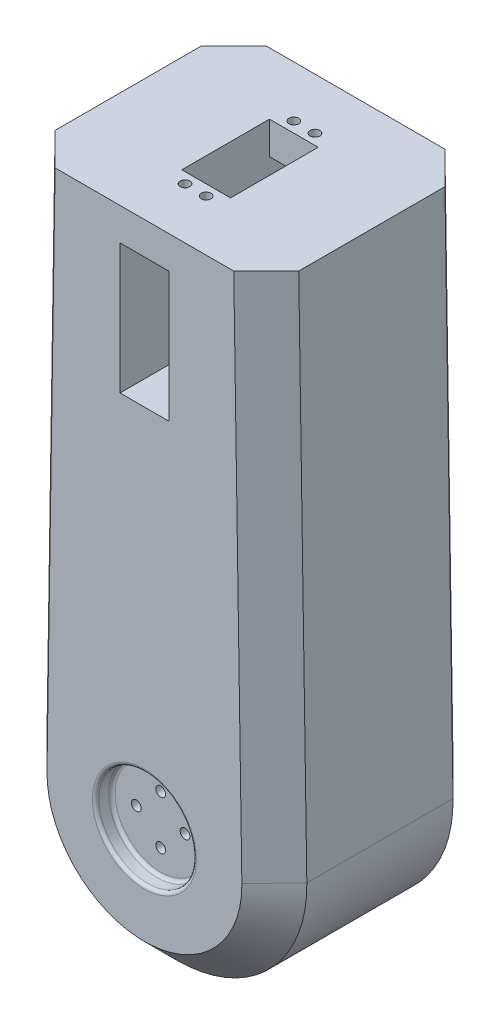
ISO-10303-21;
HEADER;
FILE_DESCRIPTION(('STEP AP214'),'2;1');
FILE_NAME('part.step','',(''),(''),'','','');
FILE_SCHEMA(('AUTOMOTIVE_DESIGN { 1 0 10303 214 1 1 1 1 }'));
ENDSEC;
DATA;
#1=APPLICATION_CONTEXT('core data for automotive mechanical design processes');
#2=APPLICATION_PROTOCOL_DEFINITION('international standard','automotive_design',2000,#1);
#3=PRODUCT_CONTEXT('',#1,'mechanical');
#4=PRODUCT('Part','Part','',(#3));
#5=PRODUCT_RELATED_PRODUCT_CATEGORY('part','',(#4));
#6=PRODUCT_DEFINITION_FORMATION('','',#4);
#7=PRODUCT_DEFINITION_CONTEXT('part definition',#1,'design');
#8=PRODUCT_DEFINITION('design','',#6,#7);
#9=PRODUCT_DEFINITION_SHAPE('','',#8);
#10=(LENGTH_UNIT() NAMED_UNIT(*) SI_UNIT(.MILLI.,.METRE.));
#11=(NAMED_UNIT(*) PLANE_ANGLE_UNIT() SI_UNIT($,.RADIAN.));
#12=(NAMED_UNIT(*) SI_UNIT($,.STERADIAN.) SOLID_ANGLE_UNIT());
#13=UNCERTAINTY_MEASURE_WITH_UNIT(LENGTH_MEASURE(1.E-05),#10,'distance_accuracy_value','');
#14=(GEOMETRIC_REPRESENTATION_CONTEXT(3) GLOBAL_UNCERTAINTY_ASSIGNED_CONTEXT((#13)) GLOBAL_UNIT_ASSIGNED_CONTEXT((#10,
#11,#12)) REPRESENTATION_CONTEXT('',''));
#15=CARTESIAN_POINT('',(0.,0.,0.));
#16=DIRECTION('',(0.,0.,1.));
#17=DIRECTION('',(1.,0.,0.));
#18=AXIS2_PLACEMENT_3D('',#15,#16,#17);
#19=CARTESIAN_POINT('',(-7.49999999999999,152.5,0.));
#20=DIRECTION('',(0.,1.,0.));
#21=DIRECTION('',(0.,0.,1.));
#22=AXIS2_PLACEMENT_3D('',#19,#20,#21);
#23=PLANE('',#22);
#24=CARTESIAN_POINT('',(-3.25,152.5,49.25));
#25=DIRECTION('',(0.,1.,0.));
#26=DIRECTION('',(0.,0.,1.));
#27=AXIS2_PLACEMENT_3D('',#24,#25,#26);
#28=CIRCLE('',#27,1.5);
#29=CARTESIAN_POINT('',(-3.25,152.5,50.75));
#30=VERTEX_POINT('',#29);
#31=EDGE_CURVE('E497',#30,#30,#28,.F.);
#32=ORIENTED_EDGE('',*,*,#31,.F.);
#33=EDGE_LOOP('',(#32));
#34=FACE_BOUND('',#33,.T.);
#35=CARTESIAN_POINT('',(3.25,152.5,49.25));
#36=DIRECTION('',(0.,1.,0.));
#37=DIRECTION('',(0.,0.,1.));
#38=AXIS2_PLACEMENT_3D('',#35,#36,#37);
#39=CIRCLE('',#38,1.5);
#40=CARTESIAN_POINT('',(3.25,152.5,50.75));
#41=VERTEX_POINT('',#40);
#42=EDGE_CURVE('E491',#41,#41,#39,.F.);
#43=ORIENTED_EDGE('',*,*,#42,.F.);
#44=EDGE_LOOP('',(#43));
#45=FACE_BOUND('',#44,.T.);
#46=DIRECTION('',(0.,0.,1.));
#47=VECTOR('',#46,1.);
#48=CARTESIAN_POINT('',(-7.49999999999999,152.5,0.));
#49=LINE('',#48,#47);
#50=CARTESIAN_POINT('',(-7.49999999999999,152.5,46.));
#51=VERTEX_POINT('',#50);
#52=CARTESIAN_POINT('',(-7.49999999999999,152.5,65.));
#53=VERTEX_POINT('',#52);
#54=EDGE_CURVE('E239',#51,#53,#49,.T.);
#55=ORIENTED_EDGE('',*,*,#54,.F.);
#56=DIRECTION('',(-1.,0.,0.));
#57=VECTOR('',#56,1.);
#58=CARTESIAN_POINT('',(-7.49999999999999,152.5,46.));
#59=LINE('',#58,#57);
#60=CARTESIAN_POINT('',(7.50000000000001,152.5,46.));
#61=VERTEX_POINT('',#60);
#62=EDGE_CURVE('E190',#61,#51,#59,.T.);
#63=ORIENTED_EDGE('',*,*,#62,.F.);
#64=DIRECTION('',(0.,0.,1.));
#65=VECTOR('',#64,1.);
#66=CARTESIAN_POINT('',(7.50000000000001,152.5,0.));
#67=LINE('',#66,#65);
#68=CARTESIAN_POINT('',(7.50000000000001,152.5,65.));
#69=VERTEX_POINT('',#68);
#70=EDGE_CURVE('E216',#61,#69,#67,.T.);
#71=ORIENTED_EDGE('',*,*,#70,.T.);
#72=DIRECTION('',(-1.,0.,0.));
#73=VECTOR('',#72,1.);
#74=CARTESIAN_POINT('',(-7.49999999999999,152.5,65.));
#75=LINE('',#74,#73);
#76=EDGE_CURVE('E220',#69,#53,#75,.T.);
#77=ORIENTED_EDGE('',*,*,#76,.T.);
#78=EDGE_LOOP('',(#55,#63,#71,#77));
#79=FACE_BOUND('',#78,.T.);
#80=ADVANCED_FACE('F44',(#34,#45,#79),#23,.F.);
#81=CARTESIAN_POINT('',(37.5,162.5,65.));
#82=DIRECTION('',(-0.999881227698869,-0.0154120243771841,0.));
#83=DIRECTION('',(0.0154120243771841,-0.999881227698869,0.));
#84=AXIS2_PLACEMENT_3D('',#81,#82,#83);
#85=PLANE('',#84);
#86=DIRECTION('',(0.,0.,-1.));
#87=VECTOR('',#86,1.);
#88=CARTESIAN_POINT('',(39.9952491079548,0.616480975087377,65.));
#89=LINE('',#88,#87);
#90=CARTESIAN_POINT('',(39.9952491079548,0.616480975087377,54.9999999999999));
#91=VERTEX_POINT('',#90);
#92=CARTESIAN_POINT('',(39.9952491079548,0.616480975087377,10.));
#93=VERTEX_POINT('',#92);
#94=EDGE_CURVE('E280',#91,#93,#89,.T.);
#95=ORIENTED_EDGE('',*,*,#94,.T.);
#96=DIRECTION('',(-0.0154120243771841,0.999881227698869,0.));
#97=VECTOR('',#96,1.);
#98=CARTESIAN_POINT('',(37.5,162.5,10.));
#99=LINE('',#98,#97);
#100=CARTESIAN_POINT('',(37.5,162.5,10.));
#101=VERTEX_POINT('',#100);
#102=EDGE_CURVE('E338',#93,#101,#99,.T.);
#103=ORIENTED_EDGE('',*,*,#102,.T.);
#104=DIRECTION('',(0.,0.,-1.));
#105=VECTOR('',#104,1.);
#106=CARTESIAN_POINT('',(37.5,162.5,65.));
#107=LINE('',#106,#105);
#108=CARTESIAN_POINT('',(37.5,162.5,54.9999999999999));
#109=VERTEX_POINT('',#108);
#110=EDGE_CURVE('E297',#109,#101,#107,.T.);
#111=ORIENTED_EDGE('',*,*,#110,.F.);
#112=DIRECTION('',(0.0154120243771841,-0.999881227698869,0.));
#113=VECTOR('',#112,1.);
#114=CARTESIAN_POINT('',(39.9952491079547,0.616480975087377,54.9999999999999));
#115=LINE('',#114,#113);
#116=EDGE_CURVE('E335',#109,#91,#115,.T.);
#117=ORIENTED_EDGE('',*,*,#116,.T.);
#118=EDGE_LOOP('',(#95,#103,#111,#117));
#119=FACE_BOUND('',#118,.T.);
#120=ADVANCED_FACE('F421',(#119),#85,.F.);
#121=CARTESIAN_POINT('',(-37.5,162.5,65.));
#122=DIRECTION('',(0.,-1.,0.));
#123=DIRECTION('',(0.,0.,-1.));
#124=AXIS2_PLACEMENT_3D('',#121,#122,#123);
#125=PLANE('',#124);
#126=CARTESIAN_POINT('',(-3.25,162.5,49.25));
#127=DIRECTION('',(0.,1.,0.));
#128=DIRECTION('',(0.,0.,-1.));
#129=AXIS2_PLACEMENT_3D('',#126,#127,#128);
#130=CIRCLE('',#129,1.5);
#131=CARTESIAN_POINT('',(-3.25,162.5,47.75));
#132=VERTEX_POINT('',#131);
#133=EDGE_CURVE('E472',#132,#132,#130,.T.);
#134=ORIENTED_EDGE('',*,*,#133,.F.);
#135=EDGE_LOOP('',(#134));
#136=FACE_BOUND('',#135,.T.);
#137=CARTESIAN_POINT('',(3.25,162.5,49.25));
#138=DIRECTION('',(0.,1.,0.));
#139=DIRECTION('',(0.,0.,1.));
#140=AXIS2_PLACEMENT_3D('',#137,#138,#139);
#141=CIRCLE('',#140,1.5);
#142=CARTESIAN_POINT('',(3.25,162.5,50.75));
#143=VERTEX_POINT('',#142);
#144=EDGE_CURVE('E487',#143,#143,#141,.T.);
#145=ORIENTED_EDGE('',*,*,#144,.F.);
#146=EDGE_LOOP('',(#145));
#147=FACE_BOUND('',#146,.T.);
#148=CARTESIAN_POINT('',(3.25,162.5,15.75));
#149=DIRECTION('',(0.,1.,0.));
#150=DIRECTION('',(0.,0.,-1.));
#151=AXIS2_PLACEMENT_3D('',#148,#149,#150);
#152=CIRCLE('',#151,1.5);
#153=CARTESIAN_POINT('',(3.25,162.5,14.25));
#154=VERTEX_POINT('',#153);
#155=EDGE_CURVE('E482',#154,#154,#152,.T.);
#156=ORIENTED_EDGE('',*,*,#155,.F.);
#157=EDGE_LOOP('',(#156));
#158=FACE_BOUND('',#157,.T.);
#159=CARTESIAN_POINT('',(-3.25,162.5,15.75));
#160=DIRECTION('',(0.,1.,0.));
#161=DIRECTION('',(0.,0.,1.));
#162=AXIS2_PLACEMENT_3D('',#159,#160,#161);
#163=CIRCLE('',#162,1.5);
#164=CARTESIAN_POINT('',(-3.25,162.5,17.25));
#165=VERTEX_POINT('',#164);
#166=EDGE_CURVE('E475',#165,#165,#163,.T.);
#167=ORIENTED_EDGE('',*,*,#166,.F.);
#168=EDGE_LOOP('',(#167));
#169=FACE_BOUND('',#168,.T.);
#170=DIRECTION('',(-1.,0.,0.));
#171=VECTOR('',#170,1.);
#172=CARTESIAN_POINT('',(-7.5,162.5,19.));
#173=LINE('',#172,#171);
#174=CARTESIAN_POINT('',(7.5,162.5,19.));
#175=VERTEX_POINT('',#174);
#176=CARTESIAN_POINT('',(-7.5,162.5,19.));
#177=VERTEX_POINT('',#176);
#178=EDGE_CURVE('E172',#175,#177,#173,.T.);
#179=ORIENTED_EDGE('',*,*,#178,.F.);
#180=DIRECTION('',(0.,0.,-1.));
#181=VECTOR('',#180,1.);
#182=CARTESIAN_POINT('',(7.5,162.5,19.));
#183=LINE('',#182,#181);
#184=CARTESIAN_POINT('',(7.50000000000001,162.5,46.));
#185=VERTEX_POINT('',#184);
#186=EDGE_CURVE('E60',#185,#175,#183,.T.);
#187=ORIENTED_EDGE('',*,*,#186,.F.);
#188=DIRECTION('',(1.,0.,0.));
#189=VECTOR('',#188,1.);
#190=CARTESIAN_POINT('',(-7.49999999999999,162.5,46.));
#191=LINE('',#190,#189);
#192=CARTESIAN_POINT('',(-7.49999999999999,162.5,46.));
#193=VERTEX_POINT('',#192);
#194=EDGE_CURVE('E180',#193,#185,#191,.T.);
#195=ORIENTED_EDGE('',*,*,#194,.F.);
#196=DIRECTION('',(0.,0.,1.));
#197=VECTOR('',#196,1.);
#198=CARTESIAN_POINT('',(-7.5,162.5,19.));
#199=LINE('',#198,#197);
#200=EDGE_CURVE('E163',#177,#193,#199,.T.);
#201=ORIENTED_EDGE('',*,*,#200,.F.);
#202=EDGE_LOOP('',(#179,#187,#195,#201));
#203=FACE_BOUND('',#202,.T.);
#204=DIRECTION('',(-1.,0.,0.));
#205=VECTOR('',#204,1.);
#206=CARTESIAN_POINT('',(-37.5,162.5,0.));
#207=LINE('',#206,#205);
#208=CARTESIAN_POINT('',(27.4988121359033,162.5,0.));
#209=VERTEX_POINT('',#208);
#210=CARTESIAN_POINT('',(-27.4988121359033,162.5,0.));
#211=VERTEX_POINT('',#210);
#212=EDGE_CURVE('E281',#209,#211,#207,.T.);
#213=ORIENTED_EDGE('',*,*,#212,.T.);
#214=DIRECTION('',(0.707148774783129,0.,-0.707064785095906));
#215=VECTOR('',#214,1.);
#216=CARTESIAN_POINT('',(-37.5,162.5,10.));
#217=LINE('',#216,#215);
#218=CARTESIAN_POINT('',(-37.5,162.5,10.));
#219=VERTEX_POINT('',#218);
#220=EDGE_CURVE('E326',#211,#219,#217,.F.);
#221=ORIENTED_EDGE('',*,*,#220,.T.);
#222=DIRECTION('',(0.,0.,-1.));
#223=VECTOR('',#222,1.);
#224=CARTESIAN_POINT('',(-37.5,162.5,65.));
#225=LINE('',#224,#223);
#226=CARTESIAN_POINT('',(-37.5,162.5,54.9999999999999));
#227=VERTEX_POINT('',#226);
#228=EDGE_CURVE('E293',#227,#219,#225,.T.);
#229=ORIENTED_EDGE('',*,*,#228,.F.);
#230=DIRECTION('',(0.707148774783128,0.,0.707064785095907));
#231=VECTOR('',#230,1.);
#232=CARTESIAN_POINT('',(-28.7477728165592,162.5,63.7511876612781));
#233=LINE('',#232,#231);
#234=CARTESIAN_POINT('',(-27.4988121359033,162.5,65.));
#235=VERTEX_POINT('',#234);
#236=EDGE_CURVE('E320',#227,#235,#233,.T.);
#237=ORIENTED_EDGE('',*,*,#236,.T.);
#238=DIRECTION('',(-1.,0.,0.));
#239=VECTOR('',#238,1.);
#240=CARTESIAN_POINT('',(-37.5,162.5,65.));
#241=LINE('',#240,#239);
#242=CARTESIAN_POINT('',(27.4988121359033,162.5,65.));
#243=VERTEX_POINT('',#242);
#244=EDGE_CURVE('E276',#243,#235,#241,.T.);
#245=ORIENTED_EDGE('',*,*,#244,.F.);
#246=DIRECTION('',(0.707148774783128,0.,-0.707064785095907));
#247=VECTOR('',#246,1.);
#248=CARTESIAN_POINT('',(28.7477728165592,162.5,63.7511876612781));
#249=LINE('',#248,#247);
#250=EDGE_CURVE('E317',#243,#109,#249,.T.);
#251=ORIENTED_EDGE('',*,*,#250,.T.);
#252=ORIENTED_EDGE('',*,*,#110,.T.);
#253=DIRECTION('',(0.707148774783129,0.,0.707064785095906));
#254=VECTOR('',#253,1.);
#255=CARTESIAN_POINT('',(37.5,162.5,10.));
#256=LINE('',#255,#254);
#257=EDGE_CURVE('E323',#101,#209,#256,.F.);
#258=ORIENTED_EDGE('',*,*,#257,.T.);
#259=EDGE_LOOP('',(#213,#221,#229,#237,#245,#251,#252,#258));
#260=FACE_BOUND('',#259,.T.);
#261=ADVANCED_FACE('F177',(#136,#147,#158,#169,#203,#260),#125,.F.);
#262=CARTESIAN_POINT('',(-37.5,162.5,65.));
#263=DIRECTION('',(0.999881227698869,-0.0154120243771842,0.));
#264=DIRECTION('',(0.0154120243771842,0.999881227698869,0.));
#265=AXIS2_PLACEMENT_3D('',#262,#263,#264);
#266=PLANE('',#265);
#267=ORIENTED_EDGE('',*,*,#228,.T.);
#268=DIRECTION('',(-0.0154120243771842,-0.999881227698869,0.));
#269=VECTOR('',#268,1.);
#270=CARTESIAN_POINT('',(-37.5,162.5,10.));
#271=LINE('',#270,#269);
#272=CARTESIAN_POINT('',(-39.9952491079548,0.616480975087362,10.));
#273=VERTEX_POINT('',#272);
#274=EDGE_CURVE('E304',#219,#273,#271,.T.);
#275=ORIENTED_EDGE('',*,*,#274,.T.);
#276=DIRECTION('',(0.,0.,-1.));
#277=VECTOR('',#276,1.);
#278=CARTESIAN_POINT('',(-39.9952491079548,0.616480975087362,65.));
#279=LINE('',#278,#277);
#280=CARTESIAN_POINT('',(-39.9952491079548,0.616480975087362,54.9999999999999));
#281=VERTEX_POINT('',#280);
#282=EDGE_CURVE('E289',#281,#273,#279,.T.);
#283=ORIENTED_EDGE('',*,*,#282,.F.);
#284=DIRECTION('',(0.0154120243771842,0.999881227698869,0.));
#285=VECTOR('',#284,1.);
#286=CARTESIAN_POINT('',(-37.5,162.5,54.9999999999999));
#287=LINE('',#286,#285);
#288=EDGE_CURVE('E301',#281,#227,#287,.T.);
#289=ORIENTED_EDGE('',*,*,#288,.T.);
#290=EDGE_LOOP('',(#267,#275,#283,#289));
#291=FACE_BOUND('',#290,.T.);
#292=ADVANCED_FACE('F509',(#291),#266,.F.);
#293=CARTESIAN_POINT('',(0.,0.,65.));
#294=DIRECTION('',(0.,0.,-1.));
#295=DIRECTION('',(-1.,0.,0.));
#296=AXIS2_PLACEMENT_3D('',#293,#294,#295);
#297=CYLINDRICAL_SURFACE('',#296,40.);
#298=ORIENTED_EDGE('',*,*,#282,.T.);
#299=CARTESIAN_POINT('',(0.,0.,10.));
#300=DIRECTION('',(0.,0.,1.));
#301=DIRECTION('',(1.,0.,0.));
#302=AXIS2_PLACEMENT_3D('',#299,#300,#301);
#303=CIRCLE('',#302,40.);
#304=EDGE_CURVE('E332',#273,#93,#303,.T.);
#305=ORIENTED_EDGE('',*,*,#304,.T.);
#306=ORIENTED_EDGE('',*,*,#94,.F.);
#307=CARTESIAN_POINT('',(0.,0.,54.9999999999999));
#308=DIRECTION('',(0.,0.,1.));
#309=DIRECTION('',(1.,0.,0.));
#310=AXIS2_PLACEMENT_3D('',#307,#308,#309);
#311=CIRCLE('',#310,40.);
#312=EDGE_CURVE('E329',#91,#281,#311,.F.);
#313=ORIENTED_EDGE('',*,*,#312,.T.);
#314=EDGE_LOOP('',(#298,#305,#306,#313));
#315=FACE_BOUND('',#314,.T.);
#316=ADVANCED_FACE('F605',(#315),#297,.T.);
#317=CARTESIAN_POINT('',(0.,0.,65.));
#318=DIRECTION('',(0.,0.,1.));
#319=DIRECTION('',(1.,0.,0.));
#320=AXIS2_PLACEMENT_3D('',#317,#318,#319);
#321=PLANE('',#320);
#322=DIRECTION('',(0.,1.,0.));
#323=VECTOR('',#322,1.);
#324=CARTESIAN_POINT('',(7.50000000000001,152.5,65.));
#325=LINE('',#324,#323);
#326=CARTESIAN_POINT('',(7.50000000000002,112.5,65.));
#327=VERTEX_POINT('',#326);
#328=EDGE_CURVE('E198',#327,#69,#325,.T.);
#329=ORIENTED_EDGE('',*,*,#328,.F.);
#330=DIRECTION('',(1.,0.,0.));
#331=VECTOR('',#330,1.);
#332=CARTESIAN_POINT('',(-7.49999999999998,112.5,65.));
#333=LINE('',#332,#331);
#334=CARTESIAN_POINT('',(-7.49999999999998,112.5,65.));
#335=VERTEX_POINT('',#334);
#336=EDGE_CURVE('E204',#335,#327,#333,.T.);
#337=ORIENTED_EDGE('',*,*,#336,.F.);
#338=DIRECTION('',(0.,-1.,0.));
#339=VECTOR('',#338,1.);
#340=CARTESIAN_POINT('',(-7.49999999999999,152.5,65.));
#341=LINE('',#340,#339);
#342=EDGE_CURVE('E224',#53,#335,#341,.T.);
#343=ORIENTED_EDGE('',*,*,#342,.F.);
#344=ORIENTED_EDGE('',*,*,#76,.F.);
#345=EDGE_LOOP('',(#329,#337,#343,#344));
#346=FACE_BOUND('',#345,.T.);
#347=CARTESIAN_POINT('',(0.,0.,65.));
#348=DIRECTION('',(0.,0.,1.));
#349=DIRECTION('',(1.,0.,0.));
#350=AXIS2_PLACEMENT_3D('',#347,#348,#349);
#351=CIRCLE('',#350,16.);
#352=CARTESIAN_POINT('',(16.,0.,65.));
#353=VERTEX_POINT('',#352);
#354=EDGE_CURVE('E53',#353,#353,#351,.F.);
#355=ORIENTED_EDGE('',*,*,#354,.T.);
#356=EDGE_LOOP('',(#355));
#357=FACE_BOUND('',#356,.T.);
#358=ORIENTED_EDGE('',*,*,#244,.T.);
#359=DIRECTION('',(-0.0154120243771842,-0.999881227698869,0.));
#360=VECTOR('',#359,1.);
#361=CARTESIAN_POINT('',(-29.996436830966,0.462360731315519,65.));
#362=LINE('',#361,#360);
#363=CARTESIAN_POINT('',(-29.996436830966,0.462360731315519,65.));
#364=VERTEX_POINT('',#363);
#365=EDGE_CURVE('E347',#235,#364,#362,.T.);
#366=ORIENTED_EDGE('',*,*,#365,.T.);
#367=CARTESIAN_POINT('',(0.,0.,65.));
#368=DIRECTION('',(0.,0.,1.));
#369=DIRECTION('',(1.,0.,0.));
#370=AXIS2_PLACEMENT_3D('',#367,#368,#369);
#371=CIRCLE('',#370,29.9999999999999);
#372=CARTESIAN_POINT('',(29.996436830966,0.462360731315531,65.));
#373=VERTEX_POINT('',#372);
#374=EDGE_CURVE('E344',#364,#373,#371,.T.);
#375=ORIENTED_EDGE('',*,*,#374,.T.);
#376=DIRECTION('',(-0.0154120243771841,0.999881227698869,0.));
#377=VECTOR('',#376,1.);
#378=CARTESIAN_POINT('',(27.5011877230112,162.345879756228,65.));
#379=LINE('',#378,#377);
#380=EDGE_CURVE('E341',#373,#243,#379,.T.);
#381=ORIENTED_EDGE('',*,*,#380,.T.);
#382=EDGE_LOOP('',(#358,#366,#375,#381));
#383=FACE_BOUND('',#382,.T.);
#384=ADVANCED_FACE('F374',(#346,#357,#383),#321,.T.);
#385=CARTESIAN_POINT('',(0.,0.,0.));
#386=DIRECTION('',(0.,0.,1.));
#387=DIRECTION('',(1.,0.,0.));
#388=AXIS2_PLACEMENT_3D('',#385,#386,#387);
#389=PLANE('',#388);
#390=DIRECTION('',(1.,0.,0.));
#391=VECTOR('',#390,1.);
#392=CARTESIAN_POINT('',(-7.49999999999998,112.5,0.));
#393=LINE('',#392,#391);
#394=CARTESIAN_POINT('',(-7.49999999999998,112.5,0.));
#395=VERTEX_POINT('',#394);
#396=CARTESIAN_POINT('',(7.50000000000002,112.5,0.));
#397=VERTEX_POINT('',#396);
#398=EDGE_CURVE('E212',#395,#397,#393,.T.);
#399=ORIENTED_EDGE('',*,*,#398,.T.);
#400=DIRECTION('',(0.,1.,0.));
#401=VECTOR('',#400,1.);
#402=CARTESIAN_POINT('',(7.50000000000001,152.5,0.));
#403=LINE('',#402,#401);
#404=CARTESIAN_POINT('',(7.50000000000001,152.5,0.));
#405=VERTEX_POINT('',#404);
#406=EDGE_CURVE('E199',#397,#405,#403,.T.);
#407=ORIENTED_EDGE('',*,*,#406,.T.);
#408=DIRECTION('',(-1.,0.,0.));
#409=VECTOR('',#408,1.);
#410=CARTESIAN_POINT('',(-7.49999999999999,152.5,0.));
#411=LINE('',#410,#409);
#412=CARTESIAN_POINT('',(-7.49999999999999,152.5,0.));
#413=VERTEX_POINT('',#412);
#414=EDGE_CURVE('E203',#405,#413,#411,.T.);
#415=ORIENTED_EDGE('',*,*,#414,.T.);
#416=DIRECTION('',(0.,-1.,0.));
#417=VECTOR('',#416,1.);
#418=CARTESIAN_POINT('',(-7.49999999999999,152.5,0.));
#419=LINE('',#418,#417);
#420=EDGE_CURVE('E208',#413,#395,#419,.T.);
#421=ORIENTED_EDGE('',*,*,#420,.T.);
#422=EDGE_LOOP('',(#399,#407,#415,#421));
#423=FACE_BOUND('',#422,.T.);
#424=CARTESIAN_POINT('',(0.,0.,0.));
#425=DIRECTION('',(0.,0.,1.));
#426=DIRECTION('',(1.,0.,0.));
#427=AXIS2_PLACEMENT_3D('',#424,#425,#426);
#428=CIRCLE('',#427,30.);
#429=CARTESIAN_POINT('',(29.996436830966,0.462360731315532,0.));
#430=VERTEX_POINT('',#429);
#431=CARTESIAN_POINT('',(-29.996436830966,0.46236073131552,0.));
#432=VERTEX_POINT('',#431);
#433=EDGE_CURVE('E311',#430,#432,#428,.F.);
#434=ORIENTED_EDGE('',*,*,#433,.T.);
#435=DIRECTION('',(0.0154120243771842,0.999881227698869,0.));
#436=VECTOR('',#435,1.);
#437=CARTESIAN_POINT('',(-29.996436830966,0.462360731315525,0.));
#438=LINE('',#437,#436);
#439=EDGE_CURVE('E314',#432,#211,#438,.T.);
#440=ORIENTED_EDGE('',*,*,#439,.T.);
#441=ORIENTED_EDGE('',*,*,#212,.F.);
#442=DIRECTION('',(0.0154120243771841,-0.999881227698869,0.));
#443=VECTOR('',#442,1.);
#444=CARTESIAN_POINT('',(29.996436830966,0.462360731315522,0.));
#445=LINE('',#444,#443);
#446=EDGE_CURVE('E308',#209,#430,#445,.T.);
#447=ORIENTED_EDGE('',*,*,#446,.T.);
#448=EDGE_LOOP('',(#434,#440,#441,#447));
#449=FACE_BOUND('',#448,.T.);
#450=ADVANCED_FACE('F456',(#423,#449),#389,.F.);
#451=CARTESIAN_POINT('',(37.5,162.5,10.));
#452=DIRECTION('',(-0.707022796487,-0.0108979469489192,0.707106781186548));
#453=DIRECTION('',(-0.0154120243771841,0.999881227698869,0.));
#454=AXIS2_PLACEMENT_3D('',#451,#452,#453);
#455=PLANE('',#454);
#456=ORIENTED_EDGE('',*,*,#257,.F.);
#457=ORIENTED_EDGE('',*,*,#102,.F.);
#458=DIRECTION('',(0.707022796487001,0.0108979469489195,0.707106781186547));
#459=VECTOR('',#458,1.);
#460=CARTESIAN_POINT('',(29.996436830966,0.462360731315532,0.));
#461=LINE('',#460,#459);
#462=EDGE_CURVE('E285',#430,#93,#461,.T.);
#463=ORIENTED_EDGE('',*,*,#462,.F.);
#464=ORIENTED_EDGE('',*,*,#446,.F.);
#465=EDGE_LOOP('',(#456,#457,#463,#464));
#466=FACE_BOUND('',#465,.T.);
#467=ADVANCED_FACE('F616',(#466),#455,.F.);
#468=CARTESIAN_POINT('',(0.,0.,10.));
#469=DIRECTION('',(0.,0.,1.));
#470=DIRECTION('',(1.,0.,0.));
#471=AXIS2_PLACEMENT_3D('',#468,#469,#470);
#472=CONICAL_SURFACE('',#471,40.,0.785398163397449);
#473=ORIENTED_EDGE('',*,*,#462,.T.);
#474=ORIENTED_EDGE('',*,*,#304,.F.);
#475=DIRECTION('',(-0.707022796487001,0.0108979469489193,0.707106781186547));
#476=VECTOR('',#475,1.);
#477=CARTESIAN_POINT('',(-29.996436830966,0.46236073131552,0.));
#478=LINE('',#477,#476);
#479=EDGE_CURVE('E352',#432,#273,#478,.T.);
#480=ORIENTED_EDGE('',*,*,#479,.F.);
#481=ORIENTED_EDGE('',*,*,#433,.F.);
#482=EDGE_LOOP('',(#473,#474,#480,#481));
#483=FACE_BOUND('',#482,.T.);
#484=ADVANCED_FACE('F803',(#483),#472,.T.);
#485=CARTESIAN_POINT('',(-37.5,162.5,10.));
#486=DIRECTION('',(0.707022796487,-0.0108979469489193,0.707106781186548));
#487=DIRECTION('',(-0.0154120243771842,-0.999881227698869,0.));
#488=AXIS2_PLACEMENT_3D('',#485,#486,#487);
#489=PLANE('',#488);
#490=ORIENTED_EDGE('',*,*,#220,.F.);
#491=ORIENTED_EDGE('',*,*,#439,.F.);
#492=ORIENTED_EDGE('',*,*,#479,.T.);
#493=ORIENTED_EDGE('',*,*,#274,.F.);
#494=EDGE_LOOP('',(#490,#491,#492,#493));
#495=FACE_BOUND('',#494,.T.);
#496=ADVANCED_FACE('F793',(#495),#489,.F.);
#497=CARTESIAN_POINT('',(29.996436830966,0.462360731315522,65.));
#498=DIRECTION('',(0.707022796487001,0.0108979469489193,0.707106781186547));
#499=DIRECTION('',(0.0154120243771841,-0.999881227698869,0.));
#500=AXIS2_PLACEMENT_3D('',#497,#498,#499);
#501=PLANE('',#500);
#502=ORIENTED_EDGE('',*,*,#250,.F.);
#503=ORIENTED_EDGE('',*,*,#380,.F.);
#504=DIRECTION('',(-0.707022796487,-0.0108979469489195,0.707106781186548));
#505=VECTOR('',#504,1.);
#506=CARTESIAN_POINT('',(39.9952491079547,0.616480975087377,54.9999999999999));
#507=LINE('',#506,#505);
#508=EDGE_CURVE('E355',#91,#373,#507,.T.);
#509=ORIENTED_EDGE('',*,*,#508,.F.);
#510=ORIENTED_EDGE('',*,*,#116,.F.);
#511=EDGE_LOOP('',(#502,#503,#509,#510));
#512=FACE_BOUND('',#511,.T.);
#513=ADVANCED_FACE('F783',(#512),#501,.T.);
#514=CARTESIAN_POINT('',(0.,0.,65.));
#515=DIRECTION('',(0.,0.,-1.));
#516=DIRECTION('',(-1.,0.,0.));
#517=AXIS2_PLACEMENT_3D('',#514,#515,#516);
#518=CONICAL_SURFACE('',#517,29.9999999999999,0.785398163397447);
#519=ORIENTED_EDGE('',*,*,#508,.T.);
#520=ORIENTED_EDGE('',*,*,#374,.F.);
#521=DIRECTION('',(0.707022796487,-0.0108979469489193,0.707106781186548));
#522=VECTOR('',#521,1.);
#523=CARTESIAN_POINT('',(-39.9952491079548,0.616480975087362,54.9999999999999));
#524=LINE('',#523,#522);
#525=EDGE_CURVE('E248',#281,#364,#524,.T.);
#526=ORIENTED_EDGE('',*,*,#525,.F.);
#527=ORIENTED_EDGE('',*,*,#312,.F.);
#528=EDGE_LOOP('',(#519,#520,#526,#527));
#529=FACE_BOUND('',#528,.T.);
#530=ADVANCED_FACE('F773',(#529),#518,.T.);
#531=CARTESIAN_POINT('',(-29.996436830966,0.462360731315525,65.));
#532=DIRECTION('',(-0.707022796487001,0.0108979469489193,0.707106781186547));
#533=DIRECTION('',(0.0154120243771842,0.999881227698869,0.));
#534=AXIS2_PLACEMENT_3D('',#531,#532,#533);
#535=PLANE('',#534);
#536=ORIENTED_EDGE('',*,*,#236,.F.);
#537=ORIENTED_EDGE('',*,*,#288,.F.);
#538=ORIENTED_EDGE('',*,*,#525,.T.);
#539=ORIENTED_EDGE('',*,*,#365,.F.);
#540=EDGE_LOOP('',(#536,#537,#538,#539));
#541=FACE_BOUND('',#540,.T.);
#542=ADVANCED_FACE('F387',(#541),#535,.T.);
#543=CARTESIAN_POINT('',(0.,0.,60.));
#544=DIRECTION('',(0.,0.,1.));
#545=DIRECTION('',(1.,0.,0.));
#546=AXIS2_PLACEMENT_3D('',#543,#544,#545);
#547=CYLINDRICAL_SURFACE('',#546,15.);
#548=CARTESIAN_POINT('',(0.,0.,64.));
#549=DIRECTION('',(0.,0.,1.));
#550=DIRECTION('',(1.,0.,0.));
#551=AXIS2_PLACEMENT_3D('',#548,#549,#550);
#552=CIRCLE('',#551,15.);
#553=CARTESIAN_POINT('',(15.,0.,64.));
#554=VERTEX_POINT('',#553);
#555=EDGE_CURVE('E367',#554,#554,#552,.T.);
#556=ORIENTED_EDGE('',*,*,#555,.T.);
#557=EDGE_LOOP('',(#556));
#558=FACE_BOUND('',#557,.T.);
#559=CARTESIAN_POINT('',(0.,0.,61.));
#560=DIRECTION('',(0.,0.,1.));
#561=DIRECTION('',(1.,0.,0.));
#562=AXIS2_PLACEMENT_3D('',#559,#560,#561);
#563=CIRCLE('',#562,15.);
#564=CARTESIAN_POINT('',(15.,0.,61.));
#565=VERTEX_POINT('',#564);
#566=EDGE_CURVE('E351',#565,#565,#563,.F.);
#567=ORIENTED_EDGE('',*,*,#566,.T.);
#568=EDGE_LOOP('',(#567));
#569=FACE_BOUND('',#568,.T.);
#570=ADVANCED_FACE('F383',(#558,#569),#547,.F.);
#571=CARTESIAN_POINT('',(0.,0.,60.));
#572=DIRECTION('',(0.,0.,1.));
#573=DIRECTION('',(1.,0.,0.));
#574=AXIS2_PLACEMENT_3D('',#571,#572,#573);
#575=PLANE('',#574);
#576=CARTESIAN_POINT('',(0.,0.,60.));
#577=DIRECTION('',(0.,0.,1.));
#578=DIRECTION('',(1.,0.,0.));
#579=AXIS2_PLACEMENT_3D('',#576,#577,#578);
#580=CIRCLE('',#579,14.);
#581=CARTESIAN_POINT('',(14.,0.,60.));
#582=VERTEX_POINT('',#581);
#583=EDGE_CURVE('E11',#582,#582,#580,.T.);
#584=ORIENTED_EDGE('',*,*,#583,.T.);
#585=EDGE_LOOP('',(#584));
#586=FACE_BOUND('',#585,.T.);
#587=CARTESIAN_POINT('',(0.,7.5,60.));
#588=DIRECTION('',(0.,0.,1.));
#589=DIRECTION('',(1.,0.,0.));
#590=AXIS2_PLACEMENT_3D('',#587,#588,#589);
#591=CIRCLE('',#590,1.5);
#592=CARTESIAN_POINT('',(1.5,7.5,60.));
#593=VERTEX_POINT('',#592);
#594=EDGE_CURVE('E249',#593,#593,#591,.T.);
#595=ORIENTED_EDGE('',*,*,#594,.F.);
#596=EDGE_LOOP('',(#595));
#597=FACE_BOUND('',#596,.T.);
#598=CARTESIAN_POINT('',(7.5,0.,60.));
#599=DIRECTION('',(0.,0.,1.));
#600=DIRECTION('',(1.,0.,0.));
#601=AXIS2_PLACEMENT_3D('',#598,#599,#600);
#602=CIRCLE('',#601,1.5);
#603=CARTESIAN_POINT('',(9.,0.,60.));
#604=VERTEX_POINT('',#603);
#605=EDGE_CURVE('E253',#604,#604,#602,.T.);
#606=ORIENTED_EDGE('',*,*,#605,.F.);
#607=EDGE_LOOP('',(#606));
#608=FACE_BOUND('',#607,.T.);
#609=CARTESIAN_POINT('',(0.,-7.5,60.));
#610=DIRECTION('',(0.,0.,1.));
#611=DIRECTION('',(1.,0.,0.));
#612=AXIS2_PLACEMENT_3D('',#609,#610,#611);
#613=CIRCLE('',#612,1.50000000000005);
#614=CARTESIAN_POINT('',(1.50000000000005,-7.5,60.));
#615=VERTEX_POINT('',#614);
#616=EDGE_CURVE('E261',#615,#615,#613,.T.);
#617=ORIENTED_EDGE('',*,*,#616,.F.);
#618=EDGE_LOOP('',(#617));
#619=FACE_BOUND('',#618,.T.);
#620=CARTESIAN_POINT('',(-7.49999999999979,-2.13519816554966E-13,60.));
#621=DIRECTION('',(0.,0.,1.));
#622=DIRECTION('',(1.,0.,0.));
#623=AXIS2_PLACEMENT_3D('',#620,#621,#622);
#624=CIRCLE('',#623,1.50000000000034);
#625=CARTESIAN_POINT('',(-5.99999999999944,-2.13519816554966E-13,60.));
#626=VERTEX_POINT('',#625);
#627=EDGE_CURVE('E269',#626,#626,#624,.T.);
#628=ORIENTED_EDGE('',*,*,#627,.F.);
#629=EDGE_LOOP('',(#628));
#630=FACE_BOUND('',#629,.T.);
#631=ADVANCED_FACE('F386',(#586,#597,#608,#619,#630),#575,.T.);
#632=CARTESIAN_POINT('',(-7.49999999999979,-2.13519816554966E-13,52.5));
#633=DIRECTION('',(0.,0.,1.));
#634=DIRECTION('',(1.,0.,0.));
#635=AXIS2_PLACEMENT_3D('',#632,#633,#634);
#636=CYLINDRICAL_SURFACE('',#635,1.50000000000034);
#637=CARTESIAN_POINT('',(-7.49999999999979,-2.13519816554966E-13,52.5));
#638=DIRECTION('',(0.,0.,1.));
#639=DIRECTION('',(1.,0.,0.));
#640=AXIS2_PLACEMENT_3D('',#637,#638,#639);
#641=CIRCLE('',#640,1.50000000000034);
#642=CARTESIAN_POINT('',(-5.99999999999944,-2.13519816554966E-13,52.5));
#643=VERTEX_POINT('',#642);
#644=EDGE_CURVE('E233',#643,#643,#641,.T.);
#645=ORIENTED_EDGE('',*,*,#644,.F.);
#646=EDGE_LOOP('',(#645));
#647=FACE_BOUND('',#646,.T.);
#648=ORIENTED_EDGE('',*,*,#627,.T.);
#649=EDGE_LOOP('',(#648));
#650=FACE_BOUND('',#649,.T.);
#651=ADVANCED_FACE('F398',(#647,#650),#636,.F.);
#652=CARTESIAN_POINT('',(-7.49999999999979,-2.13519816554966E-13,52.5));
#653=DIRECTION('',(0.,0.,1.));
#654=DIRECTION('',(1.,0.,0.));
#655=AXIS2_PLACEMENT_3D('',#652,#653,#654);
#656=PLANE('',#655);
#657=ORIENTED_EDGE('',*,*,#644,.T.);
#658=EDGE_LOOP('',(#657));
#659=FACE_BOUND('',#658,.T.);
#660=ADVANCED_FACE('F409',(#659),#656,.T.);
#661=CARTESIAN_POINT('',(0.,-7.5,52.5));
#662=DIRECTION('',(0.,0.,1.));
#663=DIRECTION('',(1.,0.,0.));
#664=AXIS2_PLACEMENT_3D('',#661,#662,#663);
#665=CYLINDRICAL_SURFACE('',#664,1.50000000000005);
#666=CARTESIAN_POINT('',(0.,-7.5,52.5));
#667=DIRECTION('',(0.,0.,1.));
#668=DIRECTION('',(1.,0.,0.));
#669=AXIS2_PLACEMENT_3D('',#666,#667,#668);
#670=CIRCLE('',#669,1.50000000000005);
#671=CARTESIAN_POINT('',(1.50000000000005,-7.5,52.5));
#672=VERTEX_POINT('',#671);
#673=EDGE_CURVE('E265',#672,#672,#670,.T.);
#674=ORIENTED_EDGE('',*,*,#673,.F.);
#675=EDGE_LOOP('',(#674));
#676=FACE_BOUND('',#675,.T.);
#677=ORIENTED_EDGE('',*,*,#616,.T.);
#678=EDGE_LOOP('',(#677));
#679=FACE_BOUND('',#678,.T.);
#680=ADVANCED_FACE('F415',(#676,#679),#665,.F.);
#681=CARTESIAN_POINT('',(0.,-7.5,52.5));
#682=DIRECTION('',(0.,0.,1.));
#683=DIRECTION('',(1.,0.,0.));
#684=AXIS2_PLACEMENT_3D('',#681,#682,#683);
#685=PLANE('',#684);
#686=ORIENTED_EDGE('',*,*,#673,.T.);
#687=EDGE_LOOP('',(#686));
#688=FACE_BOUND('',#687,.T.);
#689=ADVANCED_FACE('F553',(#688),#685,.T.);
#690=CARTESIAN_POINT('',(7.5,0.,52.5));
#691=DIRECTION('',(0.,0.,1.));
#692=DIRECTION('',(1.,0.,0.));
#693=AXIS2_PLACEMENT_3D('',#690,#691,#692);
#694=CYLINDRICAL_SURFACE('',#693,1.5);
#695=CARTESIAN_POINT('',(7.5,0.,52.5));
#696=DIRECTION('',(0.,0.,1.));
#697=DIRECTION('',(1.,0.,0.));
#698=AXIS2_PLACEMENT_3D('',#695,#696,#697);
#699=CIRCLE('',#698,1.5);
#700=CARTESIAN_POINT('',(9.,0.,52.5));
#701=VERTEX_POINT('',#700);
#702=EDGE_CURVE('E257',#701,#701,#699,.T.);
#703=ORIENTED_EDGE('',*,*,#702,.F.);
#704=EDGE_LOOP('',(#703));
#705=FACE_BOUND('',#704,.T.);
#706=ORIENTED_EDGE('',*,*,#605,.T.);
#707=EDGE_LOOP('',(#706));
#708=FACE_BOUND('',#707,.T.);
#709=ADVANCED_FACE('F550',(#705,#708),#694,.F.);
#710=CARTESIAN_POINT('',(7.5,0.,52.5));
#711=DIRECTION('',(0.,0.,1.));
#712=DIRECTION('',(1.,0.,0.));
#713=AXIS2_PLACEMENT_3D('',#710,#711,#712);
#714=PLANE('',#713);
#715=ORIENTED_EDGE('',*,*,#702,.T.);
#716=EDGE_LOOP('',(#715));
#717=FACE_BOUND('',#716,.T.);
#718=ADVANCED_FACE('F548',(#717),#714,.T.);
#719=CARTESIAN_POINT('',(0.,7.5,52.5));
#720=DIRECTION('',(0.,0.,1.));
#721=DIRECTION('',(1.,0.,0.));
#722=AXIS2_PLACEMENT_3D('',#719,#720,#721);
#723=CYLINDRICAL_SURFACE('',#722,1.5);
#724=CARTESIAN_POINT('',(0.,7.5,52.5));
#725=DIRECTION('',(0.,0.,1.));
#726=DIRECTION('',(1.,0.,0.));
#727=AXIS2_PLACEMENT_3D('',#724,#725,#726);
#728=CIRCLE('',#727,1.5);
#729=CARTESIAN_POINT('',(1.5,7.5,52.5));
#730=VERTEX_POINT('',#729);
#731=EDGE_CURVE('E244',#730,#730,#728,.T.);
#732=ORIENTED_EDGE('',*,*,#731,.F.);
#733=EDGE_LOOP('',(#732));
#734=FACE_BOUND('',#733,.T.);
#735=ORIENTED_EDGE('',*,*,#594,.T.);
#736=EDGE_LOOP('',(#735));
#737=FACE_BOUND('',#736,.T.);
#738=ADVANCED_FACE('F544',(#734,#737),#723,.F.);
#739=CARTESIAN_POINT('',(0.,7.5,52.5));
#740=DIRECTION('',(0.,0.,1.));
#741=DIRECTION('',(1.,0.,0.));
#742=AXIS2_PLACEMENT_3D('',#739,#740,#741);
#743=PLANE('',#742);
#744=ORIENTED_EDGE('',*,*,#731,.T.);
#745=EDGE_LOOP('',(#744));
#746=FACE_BOUND('',#745,.T.);
#747=ADVANCED_FACE('F380',(#746),#743,.T.);
#748=CARTESIAN_POINT('',(0.,0.,64.));
#749=DIRECTION('',(0.,0.,1.));
#750=DIRECTION('',(1.,0.,0.));
#751=AXIS2_PLACEMENT_3D('',#748,#749,#750);
#752=TOROIDAL_SURFACE('',#751,16.,1.);
#753=ORIENTED_EDGE('',*,*,#354,.F.);
#754=EDGE_LOOP('',(#753));
#755=FACE_BOUND('',#754,.T.);
#756=ORIENTED_EDGE('',*,*,#555,.F.);
#757=EDGE_LOOP('',(#756));
#758=FACE_BOUND('',#757,.T.);
#759=ADVANCED_FACE('F377',(#755,#758),#752,.T.);
#760=CARTESIAN_POINT('',(0.,0.,61.));
#761=DIRECTION('',(0.,0.,1.));
#762=DIRECTION('',(1.,0.,0.));
#763=AXIS2_PLACEMENT_3D('',#760,#761,#762);
#764=TOROIDAL_SURFACE('',#763,14.,1.);
#765=ORIENTED_EDGE('',*,*,#566,.F.);
#766=EDGE_LOOP('',(#765));
#767=FACE_BOUND('',#766,.T.);
#768=ORIENTED_EDGE('',*,*,#583,.F.);
#769=EDGE_LOOP('',(#768));
#770=FACE_BOUND('',#769,.T.);
#771=ADVANCED_FACE('F46',(#767,#770),#764,.F.);
#772=CARTESIAN_POINT('',(7.50000000000001,152.5,0.));
#773=DIRECTION('',(1.,0.,0.));
#774=DIRECTION('',(0.,1.,0.));
#775=AXIS2_PLACEMENT_3D('',#772,#773,#774);
#776=PLANE('',#775);
#777=ORIENTED_EDGE('',*,*,#328,.T.);
#778=ORIENTED_EDGE('',*,*,#70,.F.);
#779=DIRECTION('',(0.,1.,0.));
#780=VECTOR('',#779,1.);
#781=CARTESIAN_POINT('',(7.50000000000001,121.613109577039,46.));
#782=LINE('',#781,#780);
#783=EDGE_CURVE('E187',#61,#185,#782,.T.);
#784=ORIENTED_EDGE('',*,*,#783,.T.);
#785=ORIENTED_EDGE('',*,*,#186,.T.);
#786=DIRECTION('',(0.,1.,0.));
#787=VECTOR('',#786,1.);
#788=CARTESIAN_POINT('',(7.5,121.613109577039,19.));
#789=LINE('',#788,#787);
#790=CARTESIAN_POINT('',(7.5,152.5,19.));
#791=VERTEX_POINT('',#790);
#792=EDGE_CURVE('E169',#791,#175,#789,.T.);
#793=ORIENTED_EDGE('',*,*,#792,.F.);
#794=EDGE_CURVE('E240',#405,#791,#67,.T.);
#795=ORIENTED_EDGE('',*,*,#794,.F.);
#796=ORIENTED_EDGE('',*,*,#406,.F.);
#797=DIRECTION('',(0.,0.,1.));
#798=VECTOR('',#797,1.);
#799=CARTESIAN_POINT('',(7.50000000000002,112.5,0.));
#800=LINE('',#799,#798);
#801=EDGE_CURVE('E230',#397,#327,#800,.T.);
#802=ORIENTED_EDGE('',*,*,#801,.T.);
#803=EDGE_LOOP('',(#777,#778,#784,#785,#793,#795,#796,#802));
#804=FACE_BOUND('',#803,.T.);
#805=ADVANCED_FACE('F393',(#804),#776,.F.);
#806=CARTESIAN_POINT('',(-7.49999999999998,112.5,0.));
#807=DIRECTION('',(0.,-1.,0.));
#808=DIRECTION('',(0.,0.,-1.));
#809=AXIS2_PLACEMENT_3D('',#806,#807,#808);
#810=PLANE('',#809);
#811=ORIENTED_EDGE('',*,*,#336,.T.);
#812=ORIENTED_EDGE('',*,*,#801,.F.);
#813=ORIENTED_EDGE('',*,*,#398,.F.);
#814=DIRECTION('',(0.,0.,1.));
#815=VECTOR('',#814,1.);
#816=CARTESIAN_POINT('',(-7.49999999999998,112.5,0.));
#817=LINE('',#816,#815);
#818=EDGE_CURVE('E234',#395,#335,#817,.T.);
#819=ORIENTED_EDGE('',*,*,#818,.T.);
#820=EDGE_LOOP('',(#811,#812,#813,#819));
#821=FACE_BOUND('',#820,.T.);
#822=ADVANCED_FACE('F443',(#821),#810,.F.);
#823=CARTESIAN_POINT('',(-7.49999999999999,152.5,0.));
#824=DIRECTION('',(-1.,0.,0.));
#825=DIRECTION('',(0.,-1.,0.));
#826=AXIS2_PLACEMENT_3D('',#823,#824,#825);
#827=PLANE('',#826);
#828=ORIENTED_EDGE('',*,*,#342,.T.);
#829=ORIENTED_EDGE('',*,*,#818,.F.);
#830=ORIENTED_EDGE('',*,*,#420,.F.);
#831=CARTESIAN_POINT('',(-7.49999999999999,152.5,19.));
#832=VERTEX_POINT('',#831);
#833=EDGE_CURVE('E166',#413,#832,#49,.T.);
#834=ORIENTED_EDGE('',*,*,#833,.T.);
#835=DIRECTION('',(0.,1.,0.));
#836=VECTOR('',#835,1.);
#837=CARTESIAN_POINT('',(-7.5,121.613109577039,19.));
#838=LINE('',#837,#836);
#839=EDGE_CURVE('E68',#832,#177,#838,.T.);
#840=ORIENTED_EDGE('',*,*,#839,.T.);
#841=ORIENTED_EDGE('',*,*,#200,.T.);
#842=DIRECTION('',(0.,1.,0.));
#843=VECTOR('',#842,1.);
#844=CARTESIAN_POINT('',(-7.49999999999999,121.613109577039,46.));
#845=LINE('',#844,#843);
#846=EDGE_CURVE('E168',#51,#193,#845,.T.);
#847=ORIENTED_EDGE('',*,*,#846,.F.);
#848=ORIENTED_EDGE('',*,*,#54,.T.);
#849=EDGE_LOOP('',(#828,#829,#830,#834,#840,#841,#847,#848));
#850=FACE_BOUND('',#849,.T.);
#851=ADVANCED_FACE('F160',(#850),#827,.F.);
#852=CARTESIAN_POINT('',(3.25,152.5,15.75));
#853=DIRECTION('',(0.,1.,0.));
#854=DIRECTION('',(0.,0.,1.));
#855=AXIS2_PLACEMENT_3D('',#852,#853,#854);
#856=CIRCLE('',#855,1.5);
#857=CARTESIAN_POINT('',(3.25,152.5,17.25));
#858=VERTEX_POINT('',#857);
#859=EDGE_CURVE('E447',#858,#858,#856,.F.);
#860=ORIENTED_EDGE('',*,*,#859,.F.);
#861=EDGE_LOOP('',(#860));
#862=FACE_BOUND('',#861,.T.);
#863=CARTESIAN_POINT('',(-3.25,152.5,15.75));
#864=DIRECTION('',(0.,1.,0.));
#865=DIRECTION('',(0.,0.,1.));
#866=AXIS2_PLACEMENT_3D('',#863,#864,#865);
#867=CIRCLE('',#866,1.5);
#868=CARTESIAN_POINT('',(-3.25,152.5,17.25));
#869=VERTEX_POINT('',#868);
#870=EDGE_CURVE('E451',#869,#869,#867,.F.);
#871=ORIENTED_EDGE('',*,*,#870,.F.);
#872=EDGE_LOOP('',(#871));
#873=FACE_BOUND('',#872,.T.);
#874=ORIENTED_EDGE('',*,*,#794,.T.);
#875=DIRECTION('',(1.,0.,0.));
#876=VECTOR('',#875,1.);
#877=CARTESIAN_POINT('',(-7.5,152.5,19.));
#878=LINE('',#877,#876);
#879=EDGE_CURVE('E195',#832,#791,#878,.T.);
#880=ORIENTED_EDGE('',*,*,#879,.F.);
#881=ORIENTED_EDGE('',*,*,#833,.F.);
#882=ORIENTED_EDGE('',*,*,#414,.F.);
#883=EDGE_LOOP('',(#874,#880,#881,#882));
#884=FACE_BOUND('',#883,.T.);
#885=ADVANCED_FACE('F424',(#862,#873,#884),#23,.F.);
#886=CARTESIAN_POINT('',(-7.49999999999999,121.613109577039,46.));
#887=DIRECTION('',(0.,0.,1.));
#888=DIRECTION('',(1.,0.,0.));
#889=AXIS2_PLACEMENT_3D('',#886,#887,#888);
#890=PLANE('',#889);
#891=ORIENTED_EDGE('',*,*,#62,.T.);
#892=ORIENTED_EDGE('',*,*,#846,.T.);
#893=ORIENTED_EDGE('',*,*,#194,.T.);
#894=ORIENTED_EDGE('',*,*,#783,.F.);
#895=EDGE_LOOP('',(#891,#892,#893,#894));
#896=FACE_BOUND('',#895,.T.);
#897=ADVANCED_FACE('F435',(#896),#890,.F.);
#898=CARTESIAN_POINT('',(-7.5,121.613109577039,19.));
#899=DIRECTION('',(0.,0.,-1.));
#900=DIRECTION('',(-1.,0.,0.));
#901=AXIS2_PLACEMENT_3D('',#898,#899,#900);
#902=PLANE('',#901);
#903=ORIENTED_EDGE('',*,*,#879,.T.);
#904=ORIENTED_EDGE('',*,*,#792,.T.);
#905=ORIENTED_EDGE('',*,*,#178,.T.);
#906=ORIENTED_EDGE('',*,*,#839,.F.);
#907=EDGE_LOOP('',(#903,#904,#905,#906));
#908=FACE_BOUND('',#907,.T.);
#909=ADVANCED_FACE('F173',(#908),#902,.F.);
#910=CARTESIAN_POINT('',(-3.25,121.613109577039,15.75));
#911=DIRECTION('',(0.,1.,0.));
#912=DIRECTION('',(0.,0.,1.));
#913=AXIS2_PLACEMENT_3D('',#910,#911,#912);
#914=CYLINDRICAL_SURFACE('',#913,1.5);
#915=ORIENTED_EDGE('',*,*,#870,.T.);
#916=EDGE_LOOP('',(#915));
#917=FACE_BOUND('',#916,.T.);
#918=ORIENTED_EDGE('',*,*,#166,.T.);
#919=EDGE_LOOP('',(#918));
#920=FACE_BOUND('',#919,.T.);
#921=ADVANCED_FACE('F519',(#917,#920),#914,.F.);
#922=CARTESIAN_POINT('',(3.25,121.613109577039,15.75));
#923=DIRECTION('',(0.,1.,0.));
#924=DIRECTION('',(0.,0.,1.));
#925=AXIS2_PLACEMENT_3D('',#922,#923,#924);
#926=CYLINDRICAL_SURFACE('',#925,1.5);
#927=ORIENTED_EDGE('',*,*,#859,.T.);
#928=EDGE_LOOP('',(#927));
#929=FACE_BOUND('',#928,.T.);
#930=ORIENTED_EDGE('',*,*,#155,.T.);
#931=EDGE_LOOP('',(#930));
#932=FACE_BOUND('',#931,.T.);
#933=ADVANCED_FACE('F516',(#929,#932),#926,.F.);
#934=CARTESIAN_POINT('',(3.25,121.613109577039,49.25));
#935=DIRECTION('',(0.,1.,0.));
#936=DIRECTION('',(0.,0.,1.));
#937=AXIS2_PLACEMENT_3D('',#934,#935,#936);
#938=CYLINDRICAL_SURFACE('',#937,1.5);
#939=ORIENTED_EDGE('',*,*,#42,.T.);
#940=EDGE_LOOP('',(#939));
#941=FACE_BOUND('',#940,.T.);
#942=ORIENTED_EDGE('',*,*,#144,.T.);
#943=EDGE_LOOP('',(#942));
#944=FACE_BOUND('',#943,.T.);
#945=ADVANCED_FACE('F518',(#941,#944),#938,.F.);
#946=CARTESIAN_POINT('',(-3.25,121.613109577039,49.25));
#947=DIRECTION('',(0.,1.,0.));
#948=DIRECTION('',(0.,0.,1.));
#949=AXIS2_PLACEMENT_3D('',#946,#947,#948);
#950=CYLINDRICAL_SURFACE('',#949,1.5);
#951=ORIENTED_EDGE('',*,*,#31,.T.);
#952=EDGE_LOOP('',(#951));
#953=FACE_BOUND('',#952,.T.);
#954=ORIENTED_EDGE('',*,*,#133,.T.);
#955=EDGE_LOOP('',(#954));
#956=FACE_BOUND('',#955,.T.);
#957=ADVANCED_FACE('F505',(#953,#956),#950,.F.);
#958=CLOSED_SHELL('',(#80,#120,#261,#292,#316,#384,#450,#467,#484,#496,#513,#530,#542,#570,#631,
#651,#660,#680,#689,#709,#718,#738,#747,#759,#771,#805,#822,#851,#885,#897,#909,#921,#933,#945,#957));
#959=MANIFOLD_SOLID_BREP('B2',#958);
#960=ADVANCED_BREP_SHAPE_REPRESENTATION('',(#18,#959),#14);
#961=SHAPE_DEFINITION_REPRESENTATION(#9,#960);
ENDSEC;
END-ISO-10303-21;
